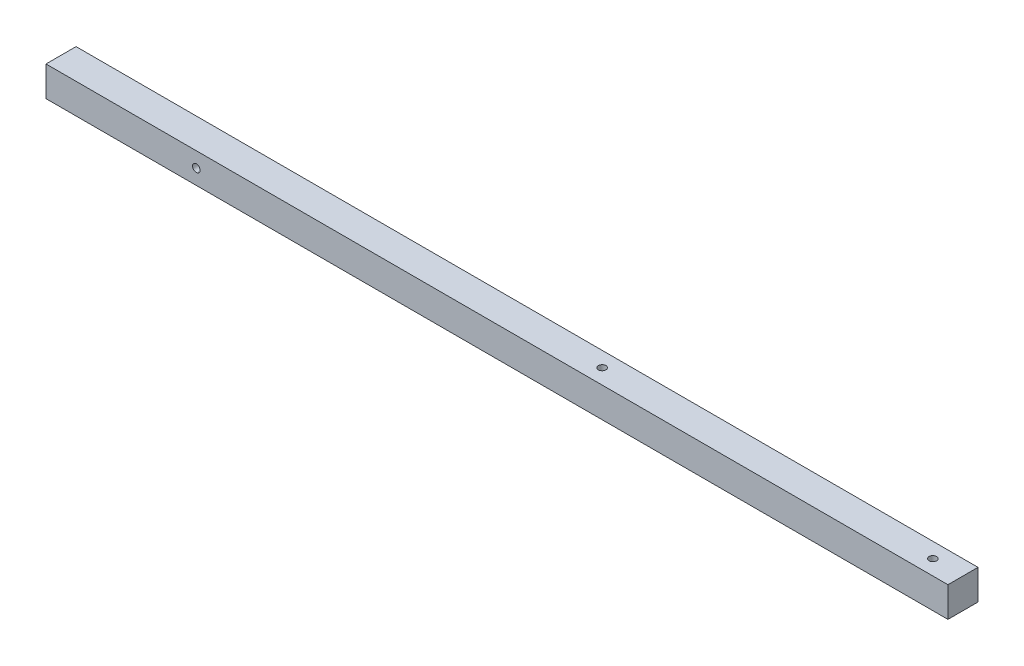
ISO-10303-21;
HEADER;
FILE_DESCRIPTION(('STEP AP214'),'2;1');
FILE_NAME('part.step','',(''),(''),'','','');
FILE_SCHEMA(('AUTOMOTIVE_DESIGN { 1 0 10303 214 1 1 1 1 }'));
ENDSEC;
DATA;
#1=APPLICATION_CONTEXT('core data for automotive mechanical design processes');
#2=APPLICATION_PROTOCOL_DEFINITION('international standard','automotive_design',2000,#1);
#3=PRODUCT_CONTEXT('',#1,'mechanical');
#4=PRODUCT('Part','Part','',(#3));
#5=PRODUCT_RELATED_PRODUCT_CATEGORY('part','',(#4));
#6=PRODUCT_DEFINITION_FORMATION('','',#4);
#7=PRODUCT_DEFINITION_CONTEXT('part definition',#1,'design');
#8=PRODUCT_DEFINITION('design','',#6,#7);
#9=PRODUCT_DEFINITION_SHAPE('','',#8);
#10=(LENGTH_UNIT() NAMED_UNIT(*) SI_UNIT(.MILLI.,.METRE.));
#11=(NAMED_UNIT(*) PLANE_ANGLE_UNIT() SI_UNIT($,.RADIAN.));
#12=(NAMED_UNIT(*) SI_UNIT($,.STERADIAN.) SOLID_ANGLE_UNIT());
#13=UNCERTAINTY_MEASURE_WITH_UNIT(LENGTH_MEASURE(1.E-05),#10,'distance_accuracy_value','');
#14=(GEOMETRIC_REPRESENTATION_CONTEXT(3) GLOBAL_UNCERTAINTY_ASSIGNED_CONTEXT((#13)) GLOBAL_UNIT_ASSIGNED_CONTEXT((#10,
#11,#12)) REPRESENTATION_CONTEXT('',''));
#15=CARTESIAN_POINT('',(0.,0.,0.));
#16=DIRECTION('',(0.,0.,1.));
#17=DIRECTION('',(1.,0.,0.));
#18=AXIS2_PLACEMENT_3D('',#15,#16,#17);
#19=CARTESIAN_POINT('',(0.,40.,40.));
#20=DIRECTION('',(1.,0.,0.));
#21=DIRECTION('',(0.,0.,-1.));
#22=AXIS2_PLACEMENT_3D('',#19,#20,#21);
#23=PLANE('',#22);
#24=DIRECTION('',(0.,-1.,0.));
#25=VECTOR('',#24,1.);
#26=CARTESIAN_POINT('',(0.,40.,0.));
#27=LINE('',#26,#25);
#28=CARTESIAN_POINT('',(0.,40.,0.));
#29=VERTEX_POINT('',#28);
#30=CARTESIAN_POINT('',(0.,0.,0.));
#31=VERTEX_POINT('',#30);
#32=EDGE_CURVE('E107',#29,#31,#27,.T.);
#33=ORIENTED_EDGE('',*,*,#32,.T.);
#34=DIRECTION('',(0.,0.,-1.));
#35=VECTOR('',#34,1.);
#36=CARTESIAN_POINT('',(0.,0.,40.));
#37=LINE('',#36,#35);
#38=CARTESIAN_POINT('',(0.,0.,40.));
#39=VERTEX_POINT('',#38);
#40=EDGE_CURVE('E11',#39,#31,#37,.T.);
#41=ORIENTED_EDGE('',*,*,#40,.F.);
#42=DIRECTION('',(0.,-1.,0.));
#43=VECTOR('',#42,1.);
#44=CARTESIAN_POINT('',(0.,40.,40.));
#45=LINE('',#44,#43);
#46=CARTESIAN_POINT('',(0.,40.,40.));
#47=VERTEX_POINT('',#46);
#48=EDGE_CURVE('E91',#47,#39,#45,.T.);
#49=ORIENTED_EDGE('',*,*,#48,.F.);
#50=DIRECTION('',(0.,0.,-1.));
#51=VECTOR('',#50,1.);
#52=CARTESIAN_POINT('',(0.,40.,40.));
#53=LINE('',#52,#51);
#54=EDGE_CURVE('E103',#47,#29,#53,.T.);
#55=ORIENTED_EDGE('',*,*,#54,.T.);
#56=EDGE_LOOP('',(#33,#41,#49,#55));
#57=FACE_BOUND('',#56,.T.);
#58=ADVANCED_FACE('F39',(#57),#23,.F.);
#59=CARTESIAN_POINT('',(0.,0.,40.));
#60=DIRECTION('',(0.,1.,0.));
#61=DIRECTION('',(0.,0.,1.));
#62=AXIS2_PLACEMENT_3D('',#59,#60,#61);
#63=PLANE('',#62);
#64=CARTESIAN_POINT('',(1160.,0.,20.));
#65=DIRECTION('',(0.,1.,0.));
#66=DIRECTION('',(-1.,0.,0.));
#67=AXIS2_PLACEMENT_3D('',#64,#65,#66);
#68=CIRCLE('',#67,4.99999999999982);
#69=CARTESIAN_POINT('',(1155.,0.,20.));
#70=VERTEX_POINT('',#69);
#71=EDGE_CURVE('E132',#70,#70,#68,.T.);
#72=ORIENTED_EDGE('',*,*,#71,.T.);
#73=EDGE_LOOP('',(#72));
#74=FACE_BOUND('',#73,.T.);
#75=CARTESIAN_POINT('',(720.,0.,20.));
#76=DIRECTION('',(0.,1.,0.));
#77=DIRECTION('',(-1.,0.,0.));
#78=AXIS2_PLACEMENT_3D('',#75,#76,#77);
#79=CIRCLE('',#78,4.99999999999981);
#80=CARTESIAN_POINT('',(715.,0.,20.));
#81=VERTEX_POINT('',#80);
#82=EDGE_CURVE('E140',#81,#81,#79,.T.);
#83=ORIENTED_EDGE('',*,*,#82,.T.);
#84=EDGE_LOOP('',(#83));
#85=FACE_BOUND('',#84,.T.);
#86=DIRECTION('',(1.,0.,0.));
#87=VECTOR('',#86,1.);
#88=CARTESIAN_POINT('',(0.,0.,0.));
#89=LINE('',#88,#87);
#90=CARTESIAN_POINT('',(1200.,0.,0.));
#91=VERTEX_POINT('',#90);
#92=EDGE_CURVE('E96',#31,#91,#89,.T.);
#93=ORIENTED_EDGE('',*,*,#92,.T.);
#94=DIRECTION('',(0.,0.,-1.));
#95=VECTOR('',#94,1.);
#96=CARTESIAN_POINT('',(1200.,0.,40.));
#97=LINE('',#96,#95);
#98=CARTESIAN_POINT('',(1200.,0.,40.));
#99=VERTEX_POINT('',#98);
#100=EDGE_CURVE('E48',#99,#91,#97,.T.);
#101=ORIENTED_EDGE('',*,*,#100,.F.);
#102=DIRECTION('',(1.,0.,0.));
#103=VECTOR('',#102,1.);
#104=CARTESIAN_POINT('',(0.,0.,40.));
#105=LINE('',#104,#103);
#106=EDGE_CURVE('E86',#39,#99,#105,.T.);
#107=ORIENTED_EDGE('',*,*,#106,.F.);
#108=ORIENTED_EDGE('',*,*,#40,.T.);
#109=EDGE_LOOP('',(#93,#101,#107,#108));
#110=FACE_BOUND('',#109,.T.);
#111=ADVANCED_FACE('F95',(#74,#85,#110),#63,.F.);
#112=CARTESIAN_POINT('',(1200.,0.,40.));
#113=DIRECTION('',(-1.,0.,0.));
#114=DIRECTION('',(0.,0.,1.));
#115=AXIS2_PLACEMENT_3D('',#112,#113,#114);
#116=PLANE('',#115);
#117=DIRECTION('',(0.,1.,0.));
#118=VECTOR('',#117,1.);
#119=CARTESIAN_POINT('',(1200.,0.,0.));
#120=LINE('',#119,#118);
#121=CARTESIAN_POINT('',(1200.,40.0000000000001,0.));
#122=VERTEX_POINT('',#121);
#123=EDGE_CURVE('E73',#91,#122,#120,.T.);
#124=ORIENTED_EDGE('',*,*,#123,.T.);
#125=DIRECTION('',(0.,0.,-1.));
#126=VECTOR('',#125,1.);
#127=CARTESIAN_POINT('',(1200.,40.0000000000001,40.));
#128=LINE('',#127,#126);
#129=CARTESIAN_POINT('',(1200.,40.0000000000001,40.));
#130=VERTEX_POINT('',#129);
#131=EDGE_CURVE('E98',#130,#122,#128,.T.);
#132=ORIENTED_EDGE('',*,*,#131,.F.);
#133=DIRECTION('',(0.,1.,0.));
#134=VECTOR('',#133,1.);
#135=CARTESIAN_POINT('',(1200.,0.,40.));
#136=LINE('',#135,#134);
#137=EDGE_CURVE('E89',#99,#130,#136,.T.);
#138=ORIENTED_EDGE('',*,*,#137,.F.);
#139=ORIENTED_EDGE('',*,*,#100,.T.);
#140=EDGE_LOOP('',(#124,#132,#138,#139));
#141=FACE_BOUND('',#140,.T.);
#142=ADVANCED_FACE('F99',(#141),#116,.F.);
#143=CARTESIAN_POINT('',(1200.,40.0000000000001,40.));
#144=DIRECTION('',(0.,-1.,0.));
#145=DIRECTION('',(1.,0.,0.));
#146=AXIS2_PLACEMENT_3D('',#143,#144,#145);
#147=PLANE('',#146);
#148=CARTESIAN_POINT('',(1160.,40.0000000000001,20.));
#149=DIRECTION('',(0.,1.,0.));
#150=DIRECTION('',(-1.,0.,0.));
#151=AXIS2_PLACEMENT_3D('',#148,#149,#150);
#152=CIRCLE('',#151,4.99999999999982);
#153=CARTESIAN_POINT('',(1155.,40.0000000000001,20.));
#154=VERTEX_POINT('',#153);
#155=EDGE_CURVE('E144',#154,#154,#152,.T.);
#156=ORIENTED_EDGE('',*,*,#155,.F.);
#157=EDGE_LOOP('',(#156));
#158=FACE_BOUND('',#157,.T.);
#159=CARTESIAN_POINT('',(720.,40.0000000000001,20.));
#160=DIRECTION('',(0.,1.,0.));
#161=DIRECTION('',(-1.,0.,0.));
#162=AXIS2_PLACEMENT_3D('',#159,#160,#161);
#163=CIRCLE('',#162,4.99999999999981);
#164=CARTESIAN_POINT('',(715.,40.0000000000001,20.));
#165=VERTEX_POINT('',#164);
#166=EDGE_CURVE('E136',#165,#165,#163,.T.);
#167=ORIENTED_EDGE('',*,*,#166,.F.);
#168=EDGE_LOOP('',(#167));
#169=FACE_BOUND('',#168,.T.);
#170=DIRECTION('',(-1.,0.,0.));
#171=VECTOR('',#170,1.);
#172=CARTESIAN_POINT('',(1200.,40.0000000000001,0.));
#173=LINE('',#172,#171);
#174=EDGE_CURVE('E79',#122,#29,#173,.T.);
#175=ORIENTED_EDGE('',*,*,#174,.T.);
#176=ORIENTED_EDGE('',*,*,#54,.F.);
#177=DIRECTION('',(-1.,0.,0.));
#178=VECTOR('',#177,1.);
#179=CARTESIAN_POINT('',(1200.,40.0000000000001,40.));
#180=LINE('',#179,#178);
#181=EDGE_CURVE('E56',#130,#47,#180,.T.);
#182=ORIENTED_EDGE('',*,*,#181,.F.);
#183=ORIENTED_EDGE('',*,*,#131,.T.);
#184=EDGE_LOOP('',(#175,#176,#182,#183));
#185=FACE_BOUND('',#184,.T.);
#186=ADVANCED_FACE('F121',(#158,#169,#185),#147,.F.);
#187=CARTESIAN_POINT('',(0.,0.,40.));
#188=DIRECTION('',(0.,0.,1.));
#189=DIRECTION('',(1.,0.,0.));
#190=AXIS2_PLACEMENT_3D('',#187,#188,#189);
#191=PLANE('',#190);
#192=CARTESIAN_POINT('',(200.,20.,40.));
#193=DIRECTION('',(0.,0.,1.));
#194=DIRECTION('',(1.,0.,0.));
#195=AXIS2_PLACEMENT_3D('',#192,#193,#194);
#196=CIRCLE('',#195,4.99999999999999);
#197=CARTESIAN_POINT('',(205.,20.,40.));
#198=VERTEX_POINT('',#197);
#199=EDGE_CURVE('E128',#198,#198,#196,.T.);
#200=ORIENTED_EDGE('',*,*,#199,.F.);
#201=EDGE_LOOP('',(#200));
#202=FACE_BOUND('',#201,.T.);
#203=ORIENTED_EDGE('',*,*,#48,.T.);
#204=ORIENTED_EDGE('',*,*,#106,.T.);
#205=ORIENTED_EDGE('',*,*,#137,.T.);
#206=ORIENTED_EDGE('',*,*,#181,.T.);
#207=EDGE_LOOP('',(#203,#204,#205,#206));
#208=FACE_BOUND('',#207,.T.);
#209=ADVANCED_FACE('F87',(#202,#208),#191,.T.);
#210=CARTESIAN_POINT('',(0.,0.,0.));
#211=DIRECTION('',(0.,0.,1.));
#212=DIRECTION('',(1.,0.,0.));
#213=AXIS2_PLACEMENT_3D('',#210,#211,#212);
#214=PLANE('',#213);
#215=CARTESIAN_POINT('',(200.,20.,0.));
#216=DIRECTION('',(0.,0.,1.));
#217=DIRECTION('',(1.,0.,0.));
#218=AXIS2_PLACEMENT_3D('',#215,#216,#217);
#219=CIRCLE('',#218,4.99999999999999);
#220=CARTESIAN_POINT('',(205.,20.,0.));
#221=VERTEX_POINT('',#220);
#222=EDGE_CURVE('E111',#221,#221,#219,.T.);
#223=ORIENTED_EDGE('',*,*,#222,.T.);
#224=EDGE_LOOP('',(#223));
#225=FACE_BOUND('',#224,.T.);
#226=ORIENTED_EDGE('',*,*,#32,.F.);
#227=ORIENTED_EDGE('',*,*,#174,.F.);
#228=ORIENTED_EDGE('',*,*,#123,.F.);
#229=ORIENTED_EDGE('',*,*,#92,.F.);
#230=EDGE_LOOP('',(#226,#227,#228,#229));
#231=FACE_BOUND('',#230,.T.);
#232=ADVANCED_FACE('F124',(#225,#231),#214,.F.);
#233=CARTESIAN_POINT('',(200.,20.,0.));
#234=DIRECTION('',(0.,0.,1.));
#235=DIRECTION('',(1.,0.,0.));
#236=AXIS2_PLACEMENT_3D('',#233,#234,#235);
#237=CYLINDRICAL_SURFACE('',#236,4.99999999999999);
#238=ORIENTED_EDGE('',*,*,#222,.F.);
#239=EDGE_LOOP('',(#238));
#240=FACE_BOUND('',#239,.T.);
#241=ORIENTED_EDGE('',*,*,#199,.T.);
#242=EDGE_LOOP('',(#241));
#243=FACE_BOUND('',#242,.T.);
#244=ADVANCED_FACE('F167',(#240,#243),#237,.F.);
#245=CARTESIAN_POINT('',(720.,0.,20.));
#246=DIRECTION('',(0.,1.,0.));
#247=DIRECTION('',(-1.,0.,0.));
#248=AXIS2_PLACEMENT_3D('',#245,#246,#247);
#249=CYLINDRICAL_SURFACE('',#248,4.99999999999981);
#250=ORIENTED_EDGE('',*,*,#82,.F.);
#251=EDGE_LOOP('',(#250));
#252=FACE_BOUND('',#251,.T.);
#253=ORIENTED_EDGE('',*,*,#166,.T.);
#254=EDGE_LOOP('',(#253));
#255=FACE_BOUND('',#254,.T.);
#256=ADVANCED_FACE('F157',(#252,#255),#249,.F.);
#257=CARTESIAN_POINT('',(1160.,0.,20.));
#258=DIRECTION('',(0.,1.,0.));
#259=DIRECTION('',(-1.,0.,0.));
#260=AXIS2_PLACEMENT_3D('',#257,#258,#259);
#261=CYLINDRICAL_SURFACE('',#260,4.99999999999982);
#262=ORIENTED_EDGE('',*,*,#71,.F.);
#263=EDGE_LOOP('',(#262));
#264=FACE_BOUND('',#263,.T.);
#265=ORIENTED_EDGE('',*,*,#155,.T.);
#266=EDGE_LOOP('',(#265));
#267=FACE_BOUND('',#266,.T.);
#268=ADVANCED_FACE('F154',(#264,#267),#261,.F.);
#269=CLOSED_SHELL('',(#58,#111,#142,#186,#209,#232,#244,#256,#268));
#270=MANIFOLD_SOLID_BREP('B2',#269);
#271=ADVANCED_BREP_SHAPE_REPRESENTATION('',(#18,#270),#14);
#272=SHAPE_DEFINITION_REPRESENTATION(#9,#271);
ENDSEC;
END-ISO-10303-21;
